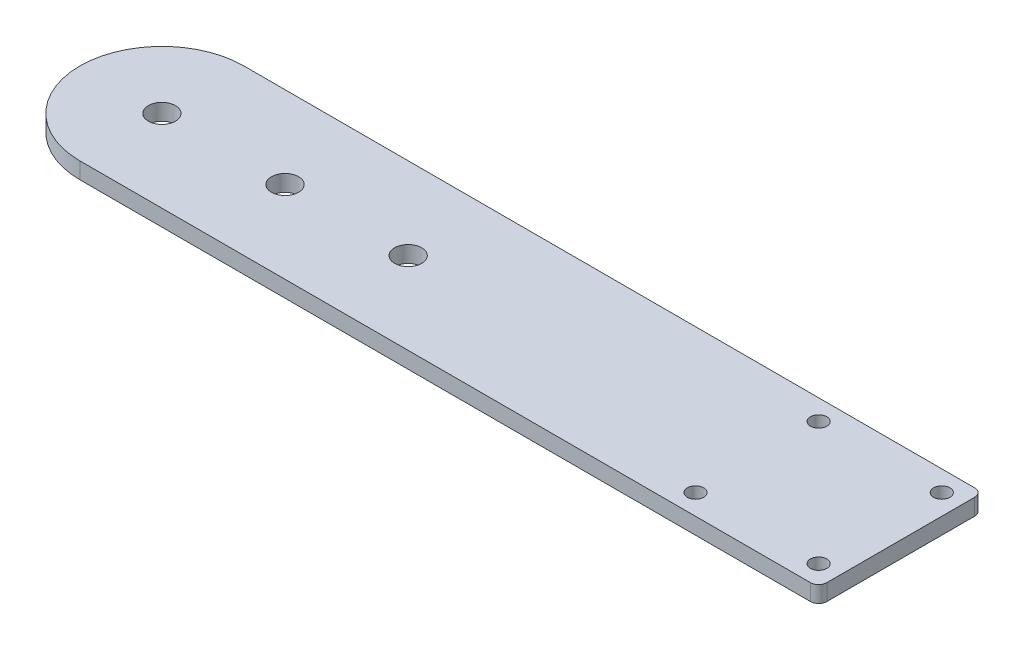
ISO-10303-21;
HEADER;
FILE_DESCRIPTION(('STEP AP214'),'2;1');
FILE_NAME('part.step','',(''),(''),'','','');
FILE_SCHEMA(('AUTOMOTIVE_DESIGN { 1 0 10303 214 1 1 1 1 }'));
ENDSEC;
DATA;
#1=APPLICATION_CONTEXT('core data for automotive mechanical design processes');
#2=APPLICATION_PROTOCOL_DEFINITION('international standard','automotive_design',2000,#1);
#3=PRODUCT_CONTEXT('',#1,'mechanical');
#4=PRODUCT('Part','Part','',(#3));
#5=PRODUCT_RELATED_PRODUCT_CATEGORY('part','',(#4));
#6=PRODUCT_DEFINITION_FORMATION('','',#4);
#7=PRODUCT_DEFINITION_CONTEXT('part definition',#1,'design');
#8=PRODUCT_DEFINITION('design','',#6,#7);
#9=PRODUCT_DEFINITION_SHAPE('','',#8);
#10=(LENGTH_UNIT() NAMED_UNIT(*) SI_UNIT(.MILLI.,.METRE.));
#11=(NAMED_UNIT(*) PLANE_ANGLE_UNIT() SI_UNIT($,.RADIAN.));
#12=(NAMED_UNIT(*) SI_UNIT($,.STERADIAN.) SOLID_ANGLE_UNIT());
#13=UNCERTAINTY_MEASURE_WITH_UNIT(LENGTH_MEASURE(1.E-05),#10,'distance_accuracy_value','');
#14=(GEOMETRIC_REPRESENTATION_CONTEXT(3) GLOBAL_UNCERTAINTY_ASSIGNED_CONTEXT((#13)) GLOBAL_UNIT_ASSIGNED_CONTEXT((#10,
#11,#12)) REPRESENTATION_CONTEXT('',''));
#15=CARTESIAN_POINT('',(0.,0.,0.));
#16=DIRECTION('',(0.,0.,1.));
#17=DIRECTION('',(1.,0.,0.));
#18=AXIS2_PLACEMENT_3D('',#15,#16,#17);
#19=CARTESIAN_POINT('',(0.,2.,0.));
#20=DIRECTION('',(0.,1.,0.));
#21=DIRECTION('',(0.,0.,1.));
#22=AXIS2_PLACEMENT_3D('',#19,#20,#21);
#23=PLANE('',#22);
#24=CARTESIAN_POINT('',(87.5,2.,7.5));
#25=DIRECTION('',(0.,1.,0.));
#26=DIRECTION('',(0.,0.,1.));
#27=AXIS2_PLACEMENT_3D('',#24,#25,#26);
#28=CIRCLE('',#27,1.00000000000001);
#29=CARTESIAN_POINT('',(87.5,2.,8.50000000000001));
#30=VERTEX_POINT('',#29);
#31=EDGE_CURVE('E295',#30,#30,#28,.T.);
#32=ORIENTED_EDGE('',*,*,#31,.F.);
#33=EDGE_LOOP('',(#32));
#34=FACE_BOUND('',#33,.T.);
#35=CARTESIAN_POINT('',(72.5,2.,-7.5));
#36=DIRECTION('',(0.,1.,0.));
#37=DIRECTION('',(0.,0.,1.));
#38=AXIS2_PLACEMENT_3D('',#35,#36,#37);
#39=CIRCLE('',#38,0.999999999999998);
#40=CARTESIAN_POINT('',(72.5,2.,-6.5));
#41=VERTEX_POINT('',#40);
#42=EDGE_CURVE('E307',#41,#41,#39,.T.);
#43=ORIENTED_EDGE('',*,*,#42,.F.);
#44=EDGE_LOOP('',(#43));
#45=FACE_BOUND('',#44,.T.);
#46=CARTESIAN_POINT('',(0.,2.,0.));
#47=DIRECTION('',(0.,1.,0.));
#48=DIRECTION('',(0.,0.,1.));
#49=AXIS2_PLACEMENT_3D('',#46,#47,#48);
#50=CIRCLE('',#49,1.65);
#51=CARTESIAN_POINT('',(0.,2.,1.65));
#52=VERTEX_POINT('',#51);
#53=EDGE_CURVE('E319',#52,#52,#50,.T.);
#54=ORIENTED_EDGE('',*,*,#53,.F.);
#55=EDGE_LOOP('',(#54));
#56=FACE_BOUND('',#55,.T.);
#57=DIRECTION('',(1.,0.,0.));
#58=VECTOR('',#57,1.);
#59=CARTESIAN_POINT('',(0.,2.,10.));
#60=LINE('',#59,#58);
#61=CARTESIAN_POINT('',(0.,2.,10.));
#62=VERTEX_POINT('',#61);
#63=CARTESIAN_POINT('',(89.,2.,10.));
#64=VERTEX_POINT('',#63);
#65=EDGE_CURVE('E87',#62,#64,#60,.T.);
#66=ORIENTED_EDGE('',*,*,#65,.T.);
#67=CARTESIAN_POINT('',(89.,2.,9.));
#68=DIRECTION('',(0.,1.,0.));
#69=DIRECTION('',(0.,0.,1.));
#70=AXIS2_PLACEMENT_3D('',#67,#68,#69);
#71=CIRCLE('',#70,1.);
#72=CARTESIAN_POINT('',(90.,2.,9.));
#73=VERTEX_POINT('',#72);
#74=EDGE_CURVE('E42',#64,#73,#71,.T.);
#75=ORIENTED_EDGE('',*,*,#74,.T.);
#76=DIRECTION('',(0.,0.,-1.));
#77=VECTOR('',#76,1.);
#78=CARTESIAN_POINT('',(90.,2.,-10.));
#79=LINE('',#78,#77);
#80=CARTESIAN_POINT('',(90.,2.,-9.));
#81=VERTEX_POINT('',#80);
#82=EDGE_CURVE('E94',#73,#81,#79,.T.);
#83=ORIENTED_EDGE('',*,*,#82,.T.);
#84=CARTESIAN_POINT('',(89.,2.,-9.));
#85=DIRECTION('',(0.,1.,0.));
#86=DIRECTION('',(0.,0.,1.));
#87=AXIS2_PLACEMENT_3D('',#84,#85,#86);
#88=CIRCLE('',#87,1.);
#89=CARTESIAN_POINT('',(89.,2.,-10.));
#90=VERTEX_POINT('',#89);
#91=EDGE_CURVE('E49',#81,#90,#88,.T.);
#92=ORIENTED_EDGE('',*,*,#91,.T.);
#93=DIRECTION('',(-1.,0.,0.));
#94=VECTOR('',#93,1.);
#95=CARTESIAN_POINT('',(0.,2.,-10.));
#96=LINE('',#95,#94);
#97=CARTESIAN_POINT('',(0.,2.,-10.));
#98=VERTEX_POINT('',#97);
#99=EDGE_CURVE('E99',#90,#98,#96,.T.);
#100=ORIENTED_EDGE('',*,*,#99,.T.);
#101=CARTESIAN_POINT('',(0.,2.,0.));
#102=DIRECTION('',(0.,1.,0.));
#103=DIRECTION('',(0.,0.,1.));
#104=AXIS2_PLACEMENT_3D('',#101,#102,#103);
#105=CIRCLE('',#104,10.);
#106=EDGE_CURVE('E95',#98,#62,#105,.T.);
#107=ORIENTED_EDGE('',*,*,#106,.T.);
#108=EDGE_LOOP('',(#66,#75,#83,#92,#100,#107));
#109=FACE_BOUND('',#108,.T.);
#110=CARTESIAN_POINT('',(30.,2.,0.));
#111=DIRECTION('',(0.,1.,0.));
#112=DIRECTION('',(0.,0.,1.));
#113=AXIS2_PLACEMENT_3D('',#110,#111,#112);
#114=CIRCLE('',#113,1.65);
#115=CARTESIAN_POINT('',(30.,2.,1.65));
#116=VERTEX_POINT('',#115);
#117=EDGE_CURVE('E140',#116,#116,#114,.T.);
#118=ORIENTED_EDGE('',*,*,#117,.F.);
#119=EDGE_LOOP('',(#118));
#120=FACE_BOUND('',#119,.T.);
#121=CARTESIAN_POINT('',(15.,2.,0.));
#122=DIRECTION('',(0.,1.,0.));
#123=DIRECTION('',(0.,0.,1.));
#124=AXIS2_PLACEMENT_3D('',#121,#122,#123);
#125=CIRCLE('',#124,1.65);
#126=CARTESIAN_POINT('',(15.,2.,1.65));
#127=VERTEX_POINT('',#126);
#128=EDGE_CURVE('E313',#127,#127,#125,.T.);
#129=ORIENTED_EDGE('',*,*,#128,.F.);
#130=EDGE_LOOP('',(#129));
#131=FACE_BOUND('',#130,.T.);
#132=CARTESIAN_POINT('',(87.5,2.,-7.5));
#133=DIRECTION('',(0.,1.,0.));
#134=DIRECTION('',(0.,0.,1.));
#135=AXIS2_PLACEMENT_3D('',#132,#133,#134);
#136=CIRCLE('',#135,0.999999999999998);
#137=CARTESIAN_POINT('',(87.5,2.,-6.5));
#138=VERTEX_POINT('',#137);
#139=EDGE_CURVE('E301',#138,#138,#136,.T.);
#140=ORIENTED_EDGE('',*,*,#139,.F.);
#141=EDGE_LOOP('',(#140));
#142=FACE_BOUND('',#141,.T.);
#143=CARTESIAN_POINT('',(72.5,2.,7.5));
#144=DIRECTION('',(0.,1.,0.));
#145=DIRECTION('',(0.,0.,1.));
#146=AXIS2_PLACEMENT_3D('',#143,#144,#145);
#147=CIRCLE('',#146,1.00000000000001);
#148=CARTESIAN_POINT('',(72.5,2.,8.50000000000001));
#149=VERTEX_POINT('',#148);
#150=EDGE_CURVE('E286',#149,#149,#147,.T.);
#151=ORIENTED_EDGE('',*,*,#150,.F.);
#152=EDGE_LOOP('',(#151));
#153=FACE_BOUND('',#152,.T.);
#154=ADVANCED_FACE('F34',(#34,#45,#56,#109,#120,#131,#142,#153),#23,.T.);
#155=CARTESIAN_POINT('',(0.,0.,0.));
#156=DIRECTION('',(0.,1.,0.));
#157=DIRECTION('',(0.,0.,1.));
#158=AXIS2_PLACEMENT_3D('',#155,#156,#157);
#159=PLANE('',#158);
#160=DIRECTION('',(0.,0.,-1.));
#161=VECTOR('',#160,1.);
#162=CARTESIAN_POINT('',(90.,0.,-10.));
#163=LINE('',#162,#161);
#164=CARTESIAN_POINT('',(90.,0.,9.));
#165=VERTEX_POINT('',#164);
#166=CARTESIAN_POINT('',(90.,0.,-9.));
#167=VERTEX_POINT('',#166);
#168=EDGE_CURVE('E137',#165,#167,#163,.T.);
#169=ORIENTED_EDGE('',*,*,#168,.F.);
#170=CARTESIAN_POINT('',(89.,0.,9.));
#171=DIRECTION('',(0.,1.,0.));
#172=DIRECTION('',(0.,0.,1.));
#173=AXIS2_PLACEMENT_3D('',#170,#171,#172);
#174=CIRCLE('',#173,1.);
#175=CARTESIAN_POINT('',(89.,0.,10.));
#176=VERTEX_POINT('',#175);
#177=EDGE_CURVE('E120',#165,#176,#174,.F.);
#178=ORIENTED_EDGE('',*,*,#177,.T.);
#179=DIRECTION('',(1.,0.,0.));
#180=VECTOR('',#179,1.);
#181=CARTESIAN_POINT('',(0.,0.,10.));
#182=LINE('',#181,#180);
#183=CARTESIAN_POINT('',(0.,0.,10.));
#184=VERTEX_POINT('',#183);
#185=EDGE_CURVE('E136',#184,#176,#182,.T.);
#186=ORIENTED_EDGE('',*,*,#185,.F.);
#187=CARTESIAN_POINT('',(0.,0.,0.));
#188=DIRECTION('',(0.,1.,0.));
#189=DIRECTION('',(0.,0.,1.));
#190=AXIS2_PLACEMENT_3D('',#187,#188,#189);
#191=CIRCLE('',#190,10.);
#192=CARTESIAN_POINT('',(0.,0.,-10.));
#193=VERTEX_POINT('',#192);
#194=EDGE_CURVE('E107',#193,#184,#191,.T.);
#195=ORIENTED_EDGE('',*,*,#194,.F.);
#196=DIRECTION('',(-1.,0.,0.));
#197=VECTOR('',#196,1.);
#198=CARTESIAN_POINT('',(0.,0.,-10.));
#199=LINE('',#198,#197);
#200=CARTESIAN_POINT('',(89.,0.,-10.));
#201=VERTEX_POINT('',#200);
#202=EDGE_CURVE('E103',#201,#193,#199,.T.);
#203=ORIENTED_EDGE('',*,*,#202,.F.);
#204=CARTESIAN_POINT('',(89.,0.,-9.));
#205=DIRECTION('',(0.,1.,0.));
#206=DIRECTION('',(0.,0.,1.));
#207=AXIS2_PLACEMENT_3D('',#204,#205,#206);
#208=CIRCLE('',#207,1.);
#209=EDGE_CURVE('E118',#201,#167,#208,.F.);
#210=ORIENTED_EDGE('',*,*,#209,.T.);
#211=EDGE_LOOP('',(#169,#178,#186,#195,#203,#210));
#212=FACE_BOUND('',#211,.T.);
#213=CARTESIAN_POINT('',(30.,0.,0.));
#214=DIRECTION('',(0.,1.,0.));
#215=DIRECTION('',(0.,0.,1.));
#216=AXIS2_PLACEMENT_3D('',#213,#214,#215);
#217=CIRCLE('',#216,1.65);
#218=CARTESIAN_POINT('',(30.,0.,1.65));
#219=VERTEX_POINT('',#218);
#220=EDGE_CURVE('E322',#219,#219,#217,.T.);
#221=ORIENTED_EDGE('',*,*,#220,.T.);
#222=EDGE_LOOP('',(#221));
#223=FACE_BOUND('',#222,.T.);
#224=CARTESIAN_POINT('',(0.,0.,0.));
#225=DIRECTION('',(0.,1.,0.));
#226=DIRECTION('',(0.,0.,1.));
#227=AXIS2_PLACEMENT_3D('',#224,#225,#226);
#228=CIRCLE('',#227,1.65);
#229=CARTESIAN_POINT('',(0.,0.,1.65));
#230=VERTEX_POINT('',#229);
#231=EDGE_CURVE('E316',#230,#230,#228,.T.);
#232=ORIENTED_EDGE('',*,*,#231,.T.);
#233=EDGE_LOOP('',(#232));
#234=FACE_BOUND('',#233,.T.);
#235=CARTESIAN_POINT('',(15.,0.,0.));
#236=DIRECTION('',(0.,1.,0.));
#237=DIRECTION('',(0.,0.,1.));
#238=AXIS2_PLACEMENT_3D('',#235,#236,#237);
#239=CIRCLE('',#238,1.65);
#240=CARTESIAN_POINT('',(15.,0.,1.65));
#241=VERTEX_POINT('',#240);
#242=EDGE_CURVE('E310',#241,#241,#239,.T.);
#243=ORIENTED_EDGE('',*,*,#242,.T.);
#244=EDGE_LOOP('',(#243));
#245=FACE_BOUND('',#244,.T.);
#246=CARTESIAN_POINT('',(72.5,0.,-7.5));
#247=DIRECTION('',(0.,1.,0.));
#248=DIRECTION('',(0.,0.,1.));
#249=AXIS2_PLACEMENT_3D('',#246,#247,#248);
#250=CIRCLE('',#249,0.999999999999998);
#251=CARTESIAN_POINT('',(72.5,0.,-6.5));
#252=VERTEX_POINT('',#251);
#253=EDGE_CURVE('E304',#252,#252,#250,.T.);
#254=ORIENTED_EDGE('',*,*,#253,.T.);
#255=EDGE_LOOP('',(#254));
#256=FACE_BOUND('',#255,.T.);
#257=CARTESIAN_POINT('',(87.5,0.,-7.5));
#258=DIRECTION('',(0.,1.,0.));
#259=DIRECTION('',(0.,0.,1.));
#260=AXIS2_PLACEMENT_3D('',#257,#258,#259);
#261=CIRCLE('',#260,0.999999999999998);
#262=CARTESIAN_POINT('',(87.5,0.,-6.5));
#263=VERTEX_POINT('',#262);
#264=EDGE_CURVE('E298',#263,#263,#261,.T.);
#265=ORIENTED_EDGE('',*,*,#264,.T.);
#266=EDGE_LOOP('',(#265));
#267=FACE_BOUND('',#266,.T.);
#268=CARTESIAN_POINT('',(87.5,0.,7.5));
#269=DIRECTION('',(0.,1.,0.));
#270=DIRECTION('',(0.,0.,1.));
#271=AXIS2_PLACEMENT_3D('',#268,#269,#270);
#272=CIRCLE('',#271,1.00000000000001);
#273=CARTESIAN_POINT('',(87.5,0.,8.50000000000001));
#274=VERTEX_POINT('',#273);
#275=EDGE_CURVE('E292',#274,#274,#272,.T.);
#276=ORIENTED_EDGE('',*,*,#275,.T.);
#277=EDGE_LOOP('',(#276));
#278=FACE_BOUND('',#277,.T.);
#279=CARTESIAN_POINT('',(72.5,0.,7.5));
#280=DIRECTION('',(0.,1.,0.));
#281=DIRECTION('',(0.,0.,1.));
#282=AXIS2_PLACEMENT_3D('',#279,#280,#281);
#283=CIRCLE('',#282,1.00000000000001);
#284=CARTESIAN_POINT('',(72.5,0.,8.50000000000001));
#285=VERTEX_POINT('',#284);
#286=EDGE_CURVE('E289',#285,#285,#283,.T.);
#287=ORIENTED_EDGE('',*,*,#286,.T.);
#288=EDGE_LOOP('',(#287));
#289=FACE_BOUND('',#288,.T.);
#290=ADVANCED_FACE('F134',(#212,#223,#234,#245,#256,#267,#278,#289),#159,.F.);
#291=CARTESIAN_POINT('',(0.,2.,0.));
#292=DIRECTION('',(0.,-1.,0.));
#293=DIRECTION('',(0.,0.,-1.));
#294=AXIS2_PLACEMENT_3D('',#291,#292,#293);
#295=CYLINDRICAL_SURFACE('',#294,10.);
#296=ORIENTED_EDGE('',*,*,#194,.T.);
#297=DIRECTION('',(0.,-1.,0.));
#298=VECTOR('',#297,1.);
#299=CARTESIAN_POINT('',(0.,2.,10.));
#300=LINE('',#299,#298);
#301=EDGE_CURVE('E91',#62,#184,#300,.T.);
#302=ORIENTED_EDGE('',*,*,#301,.F.);
#303=ORIENTED_EDGE('',*,*,#106,.F.);
#304=DIRECTION('',(0.,-1.,0.));
#305=VECTOR('',#304,1.);
#306=CARTESIAN_POINT('',(0.,2.,-10.));
#307=LINE('',#306,#305);
#308=EDGE_CURVE('E109',#98,#193,#307,.T.);
#309=ORIENTED_EDGE('',*,*,#308,.T.);
#310=EDGE_LOOP('',(#296,#302,#303,#309));
#311=FACE_BOUND('',#310,.T.);
#312=ADVANCED_FACE('F105',(#311),#295,.T.);
#313=CARTESIAN_POINT('',(0.,2.,10.));
#314=DIRECTION('',(0.,0.,-1.));
#315=DIRECTION('',(-1.,0.,0.));
#316=AXIS2_PLACEMENT_3D('',#313,#314,#315);
#317=PLANE('',#316);
#318=ORIENTED_EDGE('',*,*,#185,.T.);
#319=DIRECTION('',(0.,-1.,0.));
#320=VECTOR('',#319,1.);
#321=CARTESIAN_POINT('',(89.,2.,10.));
#322=LINE('',#321,#320);
#323=EDGE_CURVE('E57',#176,#64,#322,.F.);
#324=ORIENTED_EDGE('',*,*,#323,.T.);
#325=ORIENTED_EDGE('',*,*,#65,.F.);
#326=ORIENTED_EDGE('',*,*,#301,.T.);
#327=EDGE_LOOP('',(#318,#324,#325,#326));
#328=FACE_BOUND('',#327,.T.);
#329=ADVANCED_FACE('F89',(#328),#317,.F.);
#330=CARTESIAN_POINT('',(90.,2.,-10.));
#331=DIRECTION('',(-1.,0.,0.));
#332=DIRECTION('',(0.,0.,1.));
#333=AXIS2_PLACEMENT_3D('',#330,#331,#332);
#334=PLANE('',#333);
#335=ORIENTED_EDGE('',*,*,#82,.F.);
#336=DIRECTION('',(0.,-1.,0.));
#337=VECTOR('',#336,1.);
#338=CARTESIAN_POINT('',(90.,2.,9.));
#339=LINE('',#338,#337);
#340=EDGE_CURVE('E111',#73,#165,#339,.T.);
#341=ORIENTED_EDGE('',*,*,#340,.T.);
#342=ORIENTED_EDGE('',*,*,#168,.T.);
#343=DIRECTION('',(0.,-1.,0.));
#344=VECTOR('',#343,1.);
#345=CARTESIAN_POINT('',(90.,2.,-9.));
#346=LINE('',#345,#344);
#347=EDGE_CURVE('E108',#167,#81,#346,.F.);
#348=ORIENTED_EDGE('',*,*,#347,.T.);
#349=EDGE_LOOP('',(#335,#341,#342,#348));
#350=FACE_BOUND('',#349,.T.);
#351=ADVANCED_FACE('F127',(#350),#334,.F.);
#352=CARTESIAN_POINT('',(0.,2.,-10.));
#353=DIRECTION('',(0.,0.,1.));
#354=DIRECTION('',(1.,0.,0.));
#355=AXIS2_PLACEMENT_3D('',#352,#353,#354);
#356=PLANE('',#355);
#357=ORIENTED_EDGE('',*,*,#99,.F.);
#358=DIRECTION('',(0.,-1.,0.));
#359=VECTOR('',#358,1.);
#360=CARTESIAN_POINT('',(89.,2.,-10.));
#361=LINE('',#360,#359);
#362=EDGE_CURVE('E11',#90,#201,#361,.T.);
#363=ORIENTED_EDGE('',*,*,#362,.T.);
#364=ORIENTED_EDGE('',*,*,#202,.T.);
#365=ORIENTED_EDGE('',*,*,#308,.F.);
#366=EDGE_LOOP('',(#357,#363,#364,#365));
#367=FACE_BOUND('',#366,.T.);
#368=ADVANCED_FACE('F145',(#367),#356,.F.);
#369=CARTESIAN_POINT('',(30.,2.,0.));
#370=DIRECTION('',(0.,-1.,0.));
#371=DIRECTION('',(0.,0.,-1.));
#372=AXIS2_PLACEMENT_3D('',#369,#370,#371);
#373=CYLINDRICAL_SURFACE('',#372,1.65);
#374=ORIENTED_EDGE('',*,*,#117,.T.);
#375=EDGE_LOOP('',(#374));
#376=FACE_BOUND('',#375,.T.);
#377=ORIENTED_EDGE('',*,*,#220,.F.);
#378=EDGE_LOOP('',(#377));
#379=FACE_BOUND('',#378,.T.);
#380=ADVANCED_FACE('F163',(#376,#379),#373,.F.);
#381=CARTESIAN_POINT('',(0.,2.,0.));
#382=DIRECTION('',(0.,-1.,0.));
#383=DIRECTION('',(0.,0.,-1.));
#384=AXIS2_PLACEMENT_3D('',#381,#382,#383);
#385=CYLINDRICAL_SURFACE('',#384,1.65);
#386=ORIENTED_EDGE('',*,*,#53,.T.);
#387=EDGE_LOOP('',(#386));
#388=FACE_BOUND('',#387,.T.);
#389=ORIENTED_EDGE('',*,*,#231,.F.);
#390=EDGE_LOOP('',(#389));
#391=FACE_BOUND('',#390,.T.);
#392=ADVANCED_FACE('F196',(#388,#391),#385,.F.);
#393=CARTESIAN_POINT('',(15.,2.,0.));
#394=DIRECTION('',(0.,-1.,0.));
#395=DIRECTION('',(0.,0.,-1.));
#396=AXIS2_PLACEMENT_3D('',#393,#394,#395);
#397=CYLINDRICAL_SURFACE('',#396,1.65);
#398=ORIENTED_EDGE('',*,*,#128,.T.);
#399=EDGE_LOOP('',(#398));
#400=FACE_BOUND('',#399,.T.);
#401=ORIENTED_EDGE('',*,*,#242,.F.);
#402=EDGE_LOOP('',(#401));
#403=FACE_BOUND('',#402,.T.);
#404=ADVANCED_FACE('F203',(#400,#403),#397,.F.);
#405=CARTESIAN_POINT('',(72.5,2.,-7.5));
#406=DIRECTION('',(0.,-1.,0.));
#407=DIRECTION('',(0.,0.,-1.));
#408=AXIS2_PLACEMENT_3D('',#405,#406,#407);
#409=CYLINDRICAL_SURFACE('',#408,0.999999999999998);
#410=ORIENTED_EDGE('',*,*,#42,.T.);
#411=EDGE_LOOP('',(#410));
#412=FACE_BOUND('',#411,.T.);
#413=ORIENTED_EDGE('',*,*,#253,.F.);
#414=EDGE_LOOP('',(#413));
#415=FACE_BOUND('',#414,.T.);
#416=ADVANCED_FACE('F210',(#412,#415),#409,.F.);
#417=CARTESIAN_POINT('',(87.5,2.,-7.5));
#418=DIRECTION('',(0.,-1.,0.));
#419=DIRECTION('',(0.,0.,-1.));
#420=AXIS2_PLACEMENT_3D('',#417,#418,#419);
#421=CYLINDRICAL_SURFACE('',#420,0.999999999999998);
#422=ORIENTED_EDGE('',*,*,#139,.T.);
#423=EDGE_LOOP('',(#422));
#424=FACE_BOUND('',#423,.T.);
#425=ORIENTED_EDGE('',*,*,#264,.F.);
#426=EDGE_LOOP('',(#425));
#427=FACE_BOUND('',#426,.T.);
#428=ADVANCED_FACE('F218',(#424,#427),#421,.F.);
#429=CARTESIAN_POINT('',(87.5,2.,7.5));
#430=DIRECTION('',(0.,-1.,0.));
#431=DIRECTION('',(0.,0.,-1.));
#432=AXIS2_PLACEMENT_3D('',#429,#430,#431);
#433=CYLINDRICAL_SURFACE('',#432,1.00000000000001);
#434=ORIENTED_EDGE('',*,*,#31,.T.);
#435=EDGE_LOOP('',(#434));
#436=FACE_BOUND('',#435,.T.);
#437=ORIENTED_EDGE('',*,*,#275,.F.);
#438=EDGE_LOOP('',(#437));
#439=FACE_BOUND('',#438,.T.);
#440=ADVANCED_FACE('F226',(#436,#439),#433,.F.);
#441=CARTESIAN_POINT('',(72.5,2.,7.5));
#442=DIRECTION('',(0.,-1.,0.));
#443=DIRECTION('',(0.,0.,-1.));
#444=AXIS2_PLACEMENT_3D('',#441,#442,#443);
#445=CYLINDRICAL_SURFACE('',#444,1.00000000000001);
#446=ORIENTED_EDGE('',*,*,#150,.T.);
#447=EDGE_LOOP('',(#446));
#448=FACE_BOUND('',#447,.T.);
#449=ORIENTED_EDGE('',*,*,#286,.F.);
#450=EDGE_LOOP('',(#449));
#451=FACE_BOUND('',#450,.T.);
#452=ADVANCED_FACE('F152',(#448,#451),#445,.F.);
#453=CARTESIAN_POINT('',(89.,2.,9.));
#454=DIRECTION('',(0.,-1.,0.));
#455=DIRECTION('',(0.,0.,-1.));
#456=AXIS2_PLACEMENT_3D('',#453,#454,#455);
#457=CYLINDRICAL_SURFACE('',#456,1.);
#458=ORIENTED_EDGE('',*,*,#74,.F.);
#459=ORIENTED_EDGE('',*,*,#323,.F.);
#460=ORIENTED_EDGE('',*,*,#177,.F.);
#461=ORIENTED_EDGE('',*,*,#340,.F.);
#462=EDGE_LOOP('',(#458,#459,#460,#461));
#463=FACE_BOUND('',#462,.T.);
#464=ADVANCED_FACE('F132',(#463),#457,.T.);
#465=CARTESIAN_POINT('',(89.,2.,-9.));
#466=DIRECTION('',(0.,-1.,0.));
#467=DIRECTION('',(0.,0.,-1.));
#468=AXIS2_PLACEMENT_3D('',#465,#466,#467);
#469=CYLINDRICAL_SURFACE('',#468,1.);
#470=ORIENTED_EDGE('',*,*,#91,.F.);
#471=ORIENTED_EDGE('',*,*,#347,.F.);
#472=ORIENTED_EDGE('',*,*,#209,.F.);
#473=ORIENTED_EDGE('',*,*,#362,.F.);
#474=EDGE_LOOP('',(#470,#471,#472,#473));
#475=FACE_BOUND('',#474,.T.);
#476=ADVANCED_FACE('F36',(#475),#469,.T.);
#477=CLOSED_SHELL('',(#154,#290,#312,#329,#351,#368,#380,#392,#404,#416,#428,#440,#452,#464,#476));
#478=MANIFOLD_SOLID_BREP('B2',#477);
#479=ADVANCED_BREP_SHAPE_REPRESENTATION('',(#18,#478),#14);
#480=SHAPE_DEFINITION_REPRESENTATION(#9,#479);
ENDSEC;
END-ISO-10303-21;
